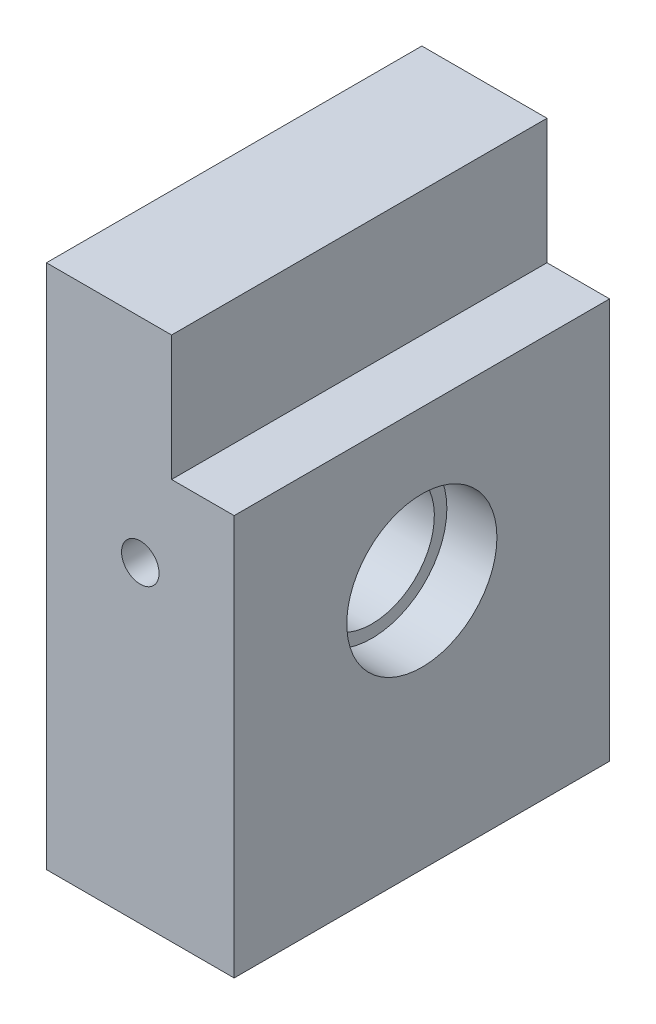
ISO-10303-21;
HEADER;
FILE_DESCRIPTION(('STEP AP214'),'2;1');
FILE_NAME('part.step','',(''),(''),'','','');
FILE_SCHEMA(('AUTOMOTIVE_DESIGN { 1 0 10303 214 1 1 1 1 }'));
ENDSEC;
DATA;
#1=APPLICATION_CONTEXT('core data for automotive mechanical design processes');
#2=APPLICATION_PROTOCOL_DEFINITION('international standard','automotive_design',2000,#1);
#3=PRODUCT_CONTEXT('',#1,'mechanical');
#4=PRODUCT('Part','Part','',(#3));
#5=PRODUCT_RELATED_PRODUCT_CATEGORY('part','',(#4));
#6=PRODUCT_DEFINITION_FORMATION('','',#4);
#7=PRODUCT_DEFINITION_CONTEXT('part definition',#1,'design');
#8=PRODUCT_DEFINITION('design','',#6,#7);
#9=PRODUCT_DEFINITION_SHAPE('','',#8);
#10=(LENGTH_UNIT() NAMED_UNIT(*) SI_UNIT(.MILLI.,.METRE.));
#11=(NAMED_UNIT(*) PLANE_ANGLE_UNIT() SI_UNIT($,.RADIAN.));
#12=(NAMED_UNIT(*) SI_UNIT($,.STERADIAN.) SOLID_ANGLE_UNIT());
#13=UNCERTAINTY_MEASURE_WITH_UNIT(LENGTH_MEASURE(1.E-05),#10,'distance_accuracy_value','');
#14=(GEOMETRIC_REPRESENTATION_CONTEXT(3) GLOBAL_UNCERTAINTY_ASSIGNED_CONTEXT((#13)) GLOBAL_UNIT_ASSIGNED_CONTEXT((#10,
#11,#12)) REPRESENTATION_CONTEXT('',''));
#15=CARTESIAN_POINT('',(0.,0.,0.));
#16=DIRECTION('',(0.,0.,1.));
#17=DIRECTION('',(1.,0.,0.));
#18=AXIS2_PLACEMENT_3D('',#15,#16,#17);
#19=CARTESIAN_POINT('',(9.99999999999952,0.,30.));
#20=DIRECTION('',(0.,-1.,0.));
#21=DIRECTION('',(1.,0.,0.));
#22=AXIS2_PLACEMENT_3D('',#19,#20,#21);
#23=PLANE('',#22);
#24=DIRECTION('',(-1.,0.,0.));
#25=VECTOR('',#24,1.);
#26=CARTESIAN_POINT('',(10.,0.,0.));
#27=LINE('',#26,#25);
#28=CARTESIAN_POINT('',(10.,0.,0.));
#29=VERTEX_POINT('',#28);
#30=CARTESIAN_POINT('',(0.,0.,0.));
#31=VERTEX_POINT('',#30);
#32=EDGE_CURVE('E153',#29,#31,#27,.T.);
#33=ORIENTED_EDGE('',*,*,#32,.T.);
#34=DIRECTION('',(0.,0.,-1.));
#35=VECTOR('',#34,1.);
#36=CARTESIAN_POINT('',(-4.85722573273506E-13,0.,30.));
#37=LINE('',#36,#35);
#38=CARTESIAN_POINT('',(-4.85722573273506E-13,0.,30.));
#39=VERTEX_POINT('',#38);
#40=EDGE_CURVE('E13',#39,#31,#37,.T.);
#41=ORIENTED_EDGE('',*,*,#40,.F.);
#42=DIRECTION('',(-1.,0.,0.));
#43=VECTOR('',#42,1.);
#44=CARTESIAN_POINT('',(9.99999999999952,0.,30.));
#45=LINE('',#44,#43);
#46=CARTESIAN_POINT('',(9.99999999999952,0.,30.));
#47=VERTEX_POINT('',#46);
#48=EDGE_CURVE('E170',#47,#39,#45,.T.);
#49=ORIENTED_EDGE('',*,*,#48,.F.);
#50=DIRECTION('',(0.,0.,-1.));
#51=VECTOR('',#50,1.);
#52=CARTESIAN_POINT('',(9.99999999999952,0.,30.));
#53=LINE('',#52,#51);
#54=EDGE_CURVE('E149',#47,#29,#53,.T.);
#55=ORIENTED_EDGE('',*,*,#54,.T.);
#56=EDGE_LOOP('',(#33,#41,#49,#55));
#57=FACE_BOUND('',#56,.T.);
#58=ADVANCED_FACE('F61',(#57),#23,.F.);
#59=CARTESIAN_POINT('',(-4.85722573273506E-13,0.,30.));
#60=DIRECTION('',(1.,0.,0.));
#61=DIRECTION('',(0.,1.,0.));
#62=AXIS2_PLACEMENT_3D('',#59,#60,#61);
#63=PLANE('',#62);
#64=CARTESIAN_POINT('',(0.,-22.,15.));
#65=DIRECTION('',(-1.,0.,0.));
#66=DIRECTION('',(0.,-1.,0.));
#67=AXIS2_PLACEMENT_3D('',#64,#65,#66);
#68=CIRCLE('',#67,5.);
#69=CARTESIAN_POINT('',(0.,-27.,15.));
#70=VERTEX_POINT('',#69);
#71=EDGE_CURVE('E188',#70,#70,#68,.T.);
#72=ORIENTED_EDGE('',*,*,#71,.F.);
#73=EDGE_LOOP('',(#72));
#74=FACE_BOUND('',#73,.T.);
#75=DIRECTION('',(0.,-1.,0.));
#76=VECTOR('',#75,1.);
#77=CARTESIAN_POINT('',(0.,0.,0.));
#78=LINE('',#77,#76);
#79=CARTESIAN_POINT('',(0.,-42.,0.));
#80=VERTEX_POINT('',#79);
#81=EDGE_CURVE('E157',#31,#80,#78,.T.);
#82=ORIENTED_EDGE('',*,*,#81,.T.);
#83=DIRECTION('',(0.,0.,-1.));
#84=VECTOR('',#83,1.);
#85=CARTESIAN_POINT('',(-4.85722573273506E-13,-42.,30.));
#86=LINE('',#85,#84);
#87=CARTESIAN_POINT('',(-4.85722573273506E-13,-42.,30.));
#88=VERTEX_POINT('',#87);
#89=EDGE_CURVE('E71',#88,#80,#86,.T.);
#90=ORIENTED_EDGE('',*,*,#89,.F.);
#91=DIRECTION('',(0.,-1.,0.));
#92=VECTOR('',#91,1.);
#93=CARTESIAN_POINT('',(-4.85722573273506E-13,0.,30.));
#94=LINE('',#93,#92);
#95=EDGE_CURVE('E117',#39,#88,#94,.T.);
#96=ORIENTED_EDGE('',*,*,#95,.F.);
#97=ORIENTED_EDGE('',*,*,#40,.T.);
#98=EDGE_LOOP('',(#82,#90,#96,#97));
#99=FACE_BOUND('',#98,.T.);
#100=ADVANCED_FACE('F234',(#74,#99),#63,.F.);
#101=CARTESIAN_POINT('',(-4.85722573273506E-13,-42.,30.));
#102=DIRECTION('',(0.,1.,0.));
#103=DIRECTION('',(0.,0.,1.));
#104=AXIS2_PLACEMENT_3D('',#101,#102,#103);
#105=PLANE('',#104);
#106=CARTESIAN_POINT('',(7.09771603936056,-42.,24.));
#107=DIRECTION('',(0.,-1.,0.));
#108=DIRECTION('',(0.,0.,-1.));
#109=AXIS2_PLACEMENT_3D('',#106,#107,#108);
#110=CIRCLE('',#109,2.5);
#111=CARTESIAN_POINT('',(7.09771603936056,-42.,21.5));
#112=VERTEX_POINT('',#111);
#113=EDGE_CURVE('E285',#112,#112,#110,.T.);
#114=ORIENTED_EDGE('',*,*,#113,.F.);
#115=EDGE_LOOP('',(#114));
#116=FACE_BOUND('',#115,.T.);
#117=CARTESIAN_POINT('',(7.09771603936105,-42.,6.));
#118=DIRECTION('',(0.,-1.,0.));
#119=DIRECTION('',(0.,0.,-1.));
#120=AXIS2_PLACEMENT_3D('',#117,#118,#119);
#121=CIRCLE('',#120,2.5);
#122=CARTESIAN_POINT('',(7.09771603936105,-42.,3.5));
#123=VERTEX_POINT('',#122);
#124=EDGE_CURVE('E281',#123,#123,#121,.T.);
#125=ORIENTED_EDGE('',*,*,#124,.F.);
#126=EDGE_LOOP('',(#125));
#127=FACE_BOUND('',#126,.T.);
#128=DIRECTION('',(1.,0.,0.));
#129=VECTOR('',#128,1.);
#130=CARTESIAN_POINT('',(0.,-42.,0.));
#131=LINE('',#130,#129);
#132=CARTESIAN_POINT('',(15.,-42.,0.));
#133=VERTEX_POINT('',#132);
#134=EDGE_CURVE('E161',#80,#133,#131,.T.);
#135=ORIENTED_EDGE('',*,*,#134,.T.);
#136=DIRECTION('',(0.,0.,-1.));
#137=VECTOR('',#136,1.);
#138=CARTESIAN_POINT('',(14.9999999999995,-42.,30.));
#139=LINE('',#138,#137);
#140=CARTESIAN_POINT('',(14.9999999999995,-42.,30.));
#141=VERTEX_POINT('',#140);
#142=EDGE_CURVE('E141',#141,#133,#139,.T.);
#143=ORIENTED_EDGE('',*,*,#142,.F.);
#144=DIRECTION('',(1.,0.,0.));
#145=VECTOR('',#144,1.);
#146=CARTESIAN_POINT('',(-4.85722573273506E-13,-42.,30.));
#147=LINE('',#146,#145);
#148=EDGE_CURVE('E130',#88,#141,#147,.T.);
#149=ORIENTED_EDGE('',*,*,#148,.F.);
#150=ORIENTED_EDGE('',*,*,#89,.T.);
#151=EDGE_LOOP('',(#135,#143,#149,#150));
#152=FACE_BOUND('',#151,.T.);
#153=ADVANCED_FACE('F239',(#116,#127,#152),#105,.F.);
#154=CARTESIAN_POINT('',(14.9999999999995,-42.,30.));
#155=DIRECTION('',(-1.,0.,0.));
#156=DIRECTION('',(0.,0.,1.));
#157=AXIS2_PLACEMENT_3D('',#154,#155,#156);
#158=PLANE('',#157);
#159=CARTESIAN_POINT('',(15.,-22.,15.));
#160=DIRECTION('',(1.,0.,0.));
#161=DIRECTION('',(0.,0.,-1.));
#162=AXIS2_PLACEMENT_3D('',#159,#160,#161);
#163=CIRCLE('',#162,6.00000000000001);
#164=CARTESIAN_POINT('',(15.,-22.,8.99999999999999));
#165=VERTEX_POINT('',#164);
#166=EDGE_CURVE('E255',#165,#165,#163,.T.);
#167=ORIENTED_EDGE('',*,*,#166,.F.);
#168=EDGE_LOOP('',(#167));
#169=FACE_BOUND('',#168,.T.);
#170=DIRECTION('',(0.,1.,0.));
#171=VECTOR('',#170,1.);
#172=CARTESIAN_POINT('',(15.,-42.,0.));
#173=LINE('',#172,#171);
#174=CARTESIAN_POINT('',(15.,-9.99999999999999,0.));
#175=VERTEX_POINT('',#174);
#176=EDGE_CURVE('E139',#133,#175,#173,.T.);
#177=ORIENTED_EDGE('',*,*,#176,.T.);
#178=DIRECTION('',(0.,0.,-1.));
#179=VECTOR('',#178,1.);
#180=CARTESIAN_POINT('',(14.9999999999995,-9.99999999999999,30.));
#181=LINE('',#180,#179);
#182=CARTESIAN_POINT('',(14.9999999999995,-9.99999999999999,30.));
#183=VERTEX_POINT('',#182);
#184=EDGE_CURVE('E136',#183,#175,#181,.T.);
#185=ORIENTED_EDGE('',*,*,#184,.F.);
#186=DIRECTION('',(0.,1.,0.));
#187=VECTOR('',#186,1.);
#188=CARTESIAN_POINT('',(14.9999999999995,-42.,30.));
#189=LINE('',#188,#187);
#190=EDGE_CURVE('E124',#141,#183,#189,.T.);
#191=ORIENTED_EDGE('',*,*,#190,.F.);
#192=ORIENTED_EDGE('',*,*,#142,.T.);
#193=EDGE_LOOP('',(#177,#185,#191,#192));
#194=FACE_BOUND('',#193,.T.);
#195=ADVANCED_FACE('F137',(#169,#194),#158,.F.);
#196=CARTESIAN_POINT('',(14.9999999999995,-9.99999999999999,30.));
#197=DIRECTION('',(0.,-1.,0.));
#198=DIRECTION('',(1.,0.,0.));
#199=AXIS2_PLACEMENT_3D('',#196,#197,#198);
#200=PLANE('',#199);
#201=DIRECTION('',(-1.,0.,0.));
#202=VECTOR('',#201,1.);
#203=CARTESIAN_POINT('',(15.,-9.99999999999999,0.));
#204=LINE('',#203,#202);
#205=CARTESIAN_POINT('',(10.,-10.,0.));
#206=VERTEX_POINT('',#205);
#207=EDGE_CURVE('E103',#175,#206,#204,.T.);
#208=ORIENTED_EDGE('',*,*,#207,.T.);
#209=DIRECTION('',(0.,0.,-1.));
#210=VECTOR('',#209,1.);
#211=CARTESIAN_POINT('',(9.99999999999952,-10.,30.));
#212=LINE('',#211,#210);
#213=CARTESIAN_POINT('',(9.99999999999952,-10.,30.));
#214=VERTEX_POINT('',#213);
#215=EDGE_CURVE('E142',#214,#206,#212,.T.);
#216=ORIENTED_EDGE('',*,*,#215,.F.);
#217=DIRECTION('',(-1.,0.,0.));
#218=VECTOR('',#217,1.);
#219=CARTESIAN_POINT('',(14.9999999999995,-9.99999999999999,30.));
#220=LINE('',#219,#218);
#221=EDGE_CURVE('E128',#183,#214,#220,.T.);
#222=ORIENTED_EDGE('',*,*,#221,.F.);
#223=ORIENTED_EDGE('',*,*,#184,.T.);
#224=EDGE_LOOP('',(#208,#216,#222,#223));
#225=FACE_BOUND('',#224,.T.);
#226=ADVANCED_FACE('F144',(#225),#200,.F.);
#227=CARTESIAN_POINT('',(9.99999999999952,-10.,30.));
#228=DIRECTION('',(-1.,0.,0.));
#229=DIRECTION('',(0.,0.,1.));
#230=AXIS2_PLACEMENT_3D('',#227,#228,#229);
#231=PLANE('',#230);
#232=DIRECTION('',(0.,1.,0.));
#233=VECTOR('',#232,1.);
#234=CARTESIAN_POINT('',(10.,-10.,0.));
#235=LINE('',#234,#233);
#236=EDGE_CURVE('E109',#206,#29,#235,.T.);
#237=ORIENTED_EDGE('',*,*,#236,.T.);
#238=ORIENTED_EDGE('',*,*,#54,.F.);
#239=DIRECTION('',(0.,1.,0.));
#240=VECTOR('',#239,1.);
#241=CARTESIAN_POINT('',(9.99999999999952,-10.,30.));
#242=LINE('',#241,#240);
#243=EDGE_CURVE('E80',#214,#47,#242,.T.);
#244=ORIENTED_EDGE('',*,*,#243,.F.);
#245=ORIENTED_EDGE('',*,*,#215,.T.);
#246=EDGE_LOOP('',(#237,#238,#244,#245));
#247=FACE_BOUND('',#246,.T.);
#248=ADVANCED_FACE('F326',(#247),#231,.F.);
#249=CARTESIAN_POINT('',(-4.85722573273506E-13,0.,30.));
#250=DIRECTION('',(0.,0.,1.));
#251=DIRECTION('',(1.,0.,0.));
#252=AXIS2_PLACEMENT_3D('',#249,#250,#251);
#253=PLANE('',#252);
#254=CARTESIAN_POINT('',(7.49999999999952,-17.,30.));
#255=DIRECTION('',(0.,0.,1.));
#256=DIRECTION('',(1.,0.,0.));
#257=AXIS2_PLACEMENT_3D('',#254,#255,#256);
#258=CIRCLE('',#257,1.5);
#259=CARTESIAN_POINT('',(8.99999999999952,-17.,30.));
#260=VERTEX_POINT('',#259);
#261=EDGE_CURVE('E269',#260,#260,#258,.T.);
#262=ORIENTED_EDGE('',*,*,#261,.F.);
#263=EDGE_LOOP('',(#262));
#264=FACE_BOUND('',#263,.T.);
#265=ORIENTED_EDGE('',*,*,#48,.T.);
#266=ORIENTED_EDGE('',*,*,#95,.T.);
#267=ORIENTED_EDGE('',*,*,#148,.T.);
#268=ORIENTED_EDGE('',*,*,#190,.T.);
#269=ORIENTED_EDGE('',*,*,#221,.T.);
#270=ORIENTED_EDGE('',*,*,#243,.T.);
#271=EDGE_LOOP('',(#265,#266,#267,#268,#269,#270));
#272=FACE_BOUND('',#271,.T.);
#273=ADVANCED_FACE('F126',(#264,#272),#253,.T.);
#274=CARTESIAN_POINT('',(0.,0.,0.));
#275=DIRECTION('',(0.,0.,1.));
#276=DIRECTION('',(1.,0.,0.));
#277=AXIS2_PLACEMENT_3D('',#274,#275,#276);
#278=PLANE('',#277);
#279=CARTESIAN_POINT('',(7.50000000000001,-17.,0.));
#280=DIRECTION('',(0.,0.,1.));
#281=DIRECTION('',(1.,0.,0.));
#282=AXIS2_PLACEMENT_3D('',#279,#280,#281);
#283=CIRCLE('',#282,1.5);
#284=CARTESIAN_POINT('',(9.00000000000001,-17.,0.));
#285=VERTEX_POINT('',#284);
#286=EDGE_CURVE('E189',#285,#285,#283,.T.);
#287=ORIENTED_EDGE('',*,*,#286,.T.);
#288=EDGE_LOOP('',(#287));
#289=FACE_BOUND('',#288,.T.);
#290=ORIENTED_EDGE('',*,*,#32,.F.);
#291=ORIENTED_EDGE('',*,*,#236,.F.);
#292=ORIENTED_EDGE('',*,*,#207,.F.);
#293=ORIENTED_EDGE('',*,*,#176,.F.);
#294=ORIENTED_EDGE('',*,*,#134,.F.);
#295=ORIENTED_EDGE('',*,*,#81,.F.);
#296=EDGE_LOOP('',(#290,#291,#292,#293,#294,#295));
#297=FACE_BOUND('',#296,.T.);
#298=ADVANCED_FACE('F245',(#289,#297),#278,.F.);
#299=CARTESIAN_POINT('',(11.,-22.,15.));
#300=DIRECTION('',(1.,0.,0.));
#301=DIRECTION('',(0.,0.,-1.));
#302=AXIS2_PLACEMENT_3D('',#299,#300,#301);
#303=CYLINDRICAL_SURFACE('',#302,6.00000000000001);
#304=CARTESIAN_POINT('',(11.,-22.,15.));
#305=DIRECTION('',(1.,0.,0.));
#306=DIRECTION('',(0.,0.,-1.));
#307=AXIS2_PLACEMENT_3D('',#304,#305,#306);
#308=CIRCLE('',#307,6.00000000000001);
#309=CARTESIAN_POINT('',(11.,-22.,8.99999999999999));
#310=VERTEX_POINT('',#309);
#311=EDGE_CURVE('E158',#310,#310,#308,.T.);
#312=ORIENTED_EDGE('',*,*,#311,.F.);
#313=EDGE_LOOP('',(#312));
#314=FACE_BOUND('',#313,.T.);
#315=ORIENTED_EDGE('',*,*,#166,.T.);
#316=EDGE_LOOP('',(#315));
#317=FACE_BOUND('',#316,.T.);
#318=ADVANCED_FACE('F331',(#314,#317),#303,.F.);
#319=CARTESIAN_POINT('',(11.,-22.,15.));
#320=DIRECTION('',(1.,0.,0.));
#321=DIRECTION('',(0.,0.,-1.));
#322=AXIS2_PLACEMENT_3D('',#319,#320,#321);
#323=PLANE('',#322);
#324=CARTESIAN_POINT('',(11.,-22.,15.));
#325=DIRECTION('',(-1.,0.,0.));
#326=DIRECTION('',(0.,-1.,0.));
#327=AXIS2_PLACEMENT_3D('',#324,#325,#326);
#328=CIRCLE('',#327,5.);
#329=CARTESIAN_POINT('',(11.,-27.,15.));
#330=VERTEX_POINT('',#329);
#331=EDGE_CURVE('E259',#330,#330,#328,.T.);
#332=ORIENTED_EDGE('',*,*,#331,.T.);
#333=EDGE_LOOP('',(#332));
#334=FACE_BOUND('',#333,.T.);
#335=ORIENTED_EDGE('',*,*,#311,.T.);
#336=EDGE_LOOP('',(#335));
#337=FACE_BOUND('',#336,.T.);
#338=ADVANCED_FACE('F337',(#334,#337),#323,.T.);
#339=CARTESIAN_POINT('',(11.,-22.,15.));
#340=DIRECTION('',(-1.,0.,0.));
#341=DIRECTION('',(0.,-1.,0.));
#342=AXIS2_PLACEMENT_3D('',#339,#340,#341);
#343=CYLINDRICAL_SURFACE('',#342,5.);
#344=CARTESIAN_POINT('',(8.99999999999999,-17.,15.));
#345=CARTESIAN_POINT('',(8.99999680695287,-16.9999994897816,14.8731208987145));
#346=CARTESIAN_POINT('',(9.00002243927703,-17.0048311758052,14.7462517245575));
#347=CARTESIAN_POINT('',(8.99983774331535,-17.0241323652151,14.4932011478343));
#348=CARTESIAN_POINT('',(8.9996273386568,-17.0386049874313,14.3670199811595));
#349=CARTESIAN_POINT('',(8.99813938827137,-17.0771302624117,14.1159729716357));
#350=CARTESIAN_POINT('',(8.99686049215628,-17.1011950178367,13.9911089958027));
#351=CARTESIAN_POINT('',(8.99185633781225,-17.1587505703489,13.7436448669534));
#352=CARTESIAN_POINT('',(8.98813192091544,-17.1922381234492,13.6210439502854));
#353=CARTESIAN_POINT('',(8.97802702475358,-17.2572422994956,13.414340087637));
#354=CARTESIAN_POINT('',(8.9727412395057,-17.2864734520119,13.3294599125743));
#355=CARTESIAN_POINT('',(8.95910201958977,-17.3493685908962,13.1616163555058));
#356=CARTESIAN_POINT('',(8.95074926634734,-17.3830315915218,13.0786525520652));
#357=CARTESIAN_POINT('',(8.92997036517553,-17.4544971607711,12.9152120682132));
#358=CARTESIAN_POINT('',(8.91755162675912,-17.4922921168313,12.8347311529492));
#359=CARTESIAN_POINT('',(8.88744166473901,-17.5716687082698,12.6767051720648));
#360=CARTESIAN_POINT('',(8.86975285817403,-17.6132486016845,12.5991587789048));
#361=CARTESIAN_POINT('',(8.82166381205752,-17.7120716468905,12.4258489109573));
#362=CARTESIAN_POINT('',(8.78906994467557,-17.7703772918708,12.3312700390514));
#363=CARTESIAN_POINT('',(8.70950549813372,-17.8900807156294,12.1503932991551));
#364=CARTESIAN_POINT('',(8.66255429795529,-17.9514742337533,12.0640844735545));
#365=CARTESIAN_POINT('',(8.5653006387692,-18.0577830794335,11.9235386935711));
#366=CARTESIAN_POINT('',(8.51893474823412,-18.102892435842,11.8667484066402));
#367=CARTESIAN_POINT('',(8.41546399613598,-18.1901626316031,11.7612032677255));
#368=CARTESIAN_POINT('',(8.35837419596545,-18.2323274938334,11.7124373238564));
#369=CARTESIAN_POINT('',(8.24533478485889,-18.3030850585277,11.6332369060855));
#370=CARTESIAN_POINT('',(8.19125853610791,-18.3327307855422,11.6010802812139));
#371=CARTESIAN_POINT('',(8.07660188607596,-18.3861899480917,11.5442946583355));
#372=CARTESIAN_POINT('',(8.01602362746817,-18.410005296534,11.5196631907167));
#373=CARTESIAN_POINT('',(7.88927005208056,-18.4501421615076,11.4787294338109));
#374=CARTESIAN_POINT('',(7.8230618367688,-18.4664154548783,11.4624806700049));
#375=CARTESIAN_POINT('',(7.68747006659442,-18.4898249251138,11.4392483851494));
#376=CARTESIAN_POINT('',(7.61808808976489,-18.4969655927673,11.4322603102775));
#377=CARTESIAN_POINT('',(7.48636396252389,-18.5012248675265,11.4280853050139));
#378=CARTESIAN_POINT('',(7.42408219499998,-18.4993545832976,11.4299096113768));
#379=CARTESIAN_POINT('',(7.30091554920826,-18.4880144532494,11.4410647197585));
#380=CARTESIAN_POINT('',(7.24003035264553,-18.4785463571229,11.4503937935129));
#381=CARTESIAN_POINT('',(7.12264368742978,-18.4529749486195,11.4759501951981));
#382=CARTESIAN_POINT('',(7.06607592465938,-18.4370194233388,11.4920241174883));
#383=CARTESIAN_POINT('',(6.95714306841908,-18.3995099465436,11.5305344788416));
#384=CARTESIAN_POINT('',(6.90477870819969,-18.377955021024,11.5529720249076));
#385=CARTESIAN_POINT('',(6.80091088680365,-18.3284784186056,11.6056908275062));
#386=CARTESIAN_POINT('',(6.74984428953364,-18.3001754384588,11.6364705431062));
#387=CARTESIAN_POINT('',(6.65408494980089,-18.2400131637562,11.7038587503746));
#388=CARTESIAN_POINT('',(6.60939586456709,-18.2081518471659,11.7404705612369));
#389=CARTESIAN_POINT('',(6.50416640550842,-18.1246911923396,11.8396058706395));
#390=CARTESIAN_POINT('',(6.44794395490473,-18.0716547645662,11.9055099061515));
#391=CARTESIAN_POINT('',(6.3490931410727,-17.9647525065291,12.0462514237448));
#392=CARTESIAN_POINT('',(6.30649688297436,-17.9108850264104,12.1211094412063));
#393=CARTESIAN_POINT('',(6.24139969809609,-17.8175304321829,12.2591609120666));
#394=CARTESIAN_POINT('',(6.2165289095522,-17.7776250383392,12.3209910830319));
#395=CARTESIAN_POINT('',(6.17246834255908,-17.6997593577396,12.4478500332991));
#396=CARTESIAN_POINT('',(6.15328170874053,-17.6618001572376,12.5128805600153));
#397=CARTESIAN_POINT('',(6.11960610830232,-17.5883434931658,12.6456306305786));
#398=CARTESIAN_POINT('',(6.10512547487031,-17.5528504830275,12.7133547086829));
#399=CARTESIAN_POINT('',(6.08002439192146,-17.4847519102586,12.850945894034));
#400=CARTESIAN_POINT('',(6.06940524940377,-17.4521473280935,12.9208137182142));
#401=CARTESIAN_POINT('',(6.04570042150571,-17.3711285344444,13.105529577748));
#402=CARTESIAN_POINT('',(6.03506707556086,-17.325215293356,13.221796423211));
#403=CARTESIAN_POINT('',(6.01906962001829,-17.2421376733064,13.4577864385022));
#404=CARTESIAN_POINT('',(6.01370857754283,-17.2049783964434,13.5775115785323));
#405=CARTESIAN_POINT('',(6.00616038727419,-17.1397229471062,13.8195654754229));
#406=CARTESIAN_POINT('',(6.00397495968877,-17.1116316931183,13.9418956070137));
#407=CARTESIAN_POINT('',(6.001213457356,-17.0647303875136,14.1883081397667));
#408=CARTESIAN_POINT('',(6.00063707893393,-17.0459185851443,14.3123902058441));
#409=CARTESIAN_POINT('',(6.00002522284629,-17.0171196945431,14.5665317074572));
#410=CARTESIAN_POINT('',(6.00001195050741,-17.0075094867417,14.696634037211));
#411=CARTESIAN_POINT('',(5.99999403588385,-16.998483738549,14.9572033026188));
#412=CARTESIAN_POINT('',(5.99998939442209,-16.9990691702083,15.0876702718518));
#413=CARTESIAN_POINT('',(6.0000256605344,-17.0104349969004,15.3482116115403));
#414=CARTESIAN_POINT('',(6.00006658659542,-17.0212195294862,15.4782858011686));
#415=CARTESIAN_POINT('',(6.00084973954553,-17.052923019816,15.7371786653582));
#416=CARTESIAN_POINT('',(6.00159186819134,-17.0738405576564,15.8659975132471));
#417=CARTESIAN_POINT('',(6.00482162299013,-17.1222533101094,16.1047179897686));
#418=CARTESIAN_POINT('',(6.00706612506278,-17.1485171280479,16.2148738015943));
#419=CARTESIAN_POINT('',(6.01424619724909,-17.208441861718,16.4330990219508));
#420=CARTESIAN_POINT('',(6.01918221179467,-17.2421039985377,16.5411680828577));
#421=CARTESIAN_POINT('',(6.03328399637473,-17.3165054786173,16.754305339526));
#422=CARTESIAN_POINT('',(6.04244014619439,-17.3572285946634,16.8593797863882));
#423=CARTESIAN_POINT('',(6.06691305487097,-17.4453678712892,17.0658932293095));
#424=CARTESIAN_POINT('',(6.08222543320826,-17.4927792572322,17.1673347546276));
#425=CARTESIAN_POINT('',(6.12292442666868,-17.5975564926964,17.3733653331926));
#426=CARTESIAN_POINT('',(6.14900854960664,-17.6554119461163,17.4775746261201));
#427=CARTESIAN_POINT('',(6.21469743084341,-17.7763540457197,17.6785252666599));
#428=CARTESIAN_POINT('',(6.25428913965026,-17.8394355986702,17.7752737119033));
#429=CARTESIAN_POINT('',(6.34072879306495,-17.9539838643767,17.9389696903704));
#430=CARTESIAN_POINT('',(6.38427200134289,-18.005085953545,18.0078927966066));
#431=CARTESIAN_POINT('',(6.48402776573655,-18.1058034750309,18.1371812074333));
#432=CARTESIAN_POINT('',(6.54021898370078,-18.1554212535945,18.1975606496084));
#433=CARTESIAN_POINT('',(6.65116576435822,-18.2381668623482,18.2941862539775));
#434=CARTESIAN_POINT('',(6.70306166448704,-18.27240353617,18.3327526181523));
#435=CARTESIAN_POINT('',(6.81456604208582,-18.3357706125666,18.40229827897));
#436=CARTESIAN_POINT('',(6.87417186310228,-18.3649027658012,18.4332801782542));
#437=CARTESIAN_POINT('',(7.00062220455018,-18.4160883929101,18.4866845352483));
#438=CARTESIAN_POINT('',(7.06752104868973,-18.4380830979942,18.5090362046613));
#439=CARTESIAN_POINT('',(7.20617325130608,-18.472669390782,18.5438050457301));
#440=CARTESIAN_POINT('',(7.27792296622768,-18.4852679523293,18.556229585818));
#441=CARTESIAN_POINT('',(7.41389743747775,-18.4988760240916,18.5696224751466));
#442=CARTESIAN_POINT('',(7.47786827653496,-18.5011936285624,18.5718844357558));
#443=CARTESIAN_POINT('',(7.60535122778707,-18.4976519022859,18.5684122052844));
#444=CARTESIAN_POINT('',(7.6688634961356,-18.4917955011225,18.5626808790183));
#445=CARTESIAN_POINT('',(7.7901867417433,-18.4728770183231,18.5439476102738));
#446=CARTESIAN_POINT('',(7.84812213152149,-18.460208148144,18.5313419354995));
#447=CARTESIAN_POINT('',(7.9604054624964,-18.4287852977327,18.4995602683782));
#448=CARTESIAN_POINT('',(8.01475320054803,-18.4100309732764,18.4803839043563));
#449=CARTESIAN_POINT('',(8.12187383340119,-18.3663137261278,18.4347304494381));
#450=CARTESIAN_POINT('',(8.17436949972235,-18.3410522340543,18.4078924612171));
#451=CARTESIAN_POINT('',(8.27350610664886,-18.2864287337407,18.3482871638363));
#452=CARTESIAN_POINT('',(8.32014381308871,-18.2570644791076,18.3155166034781));
#453=CARTESIAN_POINT('',(8.42786383909939,-18.1811923657801,18.2282210306975));
#454=CARTESIAN_POINT('',(8.48542772928115,-18.1331154020503,18.1707120219849));
#455=CARTESIAN_POINT('',(8.58814057966785,-18.0349054862801,18.0470129054134));
#456=CARTESIAN_POINT('',(8.63326370774972,-17.9847685010011,17.9808051497997));
#457=CARTESIAN_POINT('',(8.70244982265086,-17.8979715995441,17.8596194222193));
#458=CARTESIAN_POINT('',(8.72894682254172,-17.8611484856955,17.8061077633399));
#459=CARTESIAN_POINT('',(8.776695278567,-17.7886265472671,17.6960502686806));
#460=CARTESIAN_POINT('',(8.79794406409625,-17.7529283031155,17.6395029058959));
#461=CARTESIAN_POINT('',(8.85501941354745,-17.6482858546321,17.4659243883085));
#462=CARTESIAN_POINT('',(8.88409692933982,-17.5819006239052,17.3451039900029));
#463=CARTESIAN_POINT('',(8.92554828443227,-17.4697839152365,17.1190009114277));
#464=CARTESIAN_POINT('',(8.93998361588091,-17.4224840714261,17.0148223721473));
#465=CARTESIAN_POINT('',(8.96283145033517,-17.3349224871262,16.8028295839082));
#466=CARTESIAN_POINT('',(8.97123983636656,-17.2946655717865,16.6950129022957));
#467=CARTESIAN_POINT('',(8.9839987523042,-17.2216336475214,16.4766458919136));
#468=CARTESIAN_POINT('',(8.98834853239835,-17.1888600219499,16.3660950618913));
#469=CARTESIAN_POINT('',(8.99454780143949,-17.1310297475515,16.1429816458948));
#470=CARTESIAN_POINT('',(8.99639819920773,-17.1059702962699,16.0304198062538));
#471=CARTESIAN_POINT('',(8.99920171072986,-17.0566291796072,15.7659732070961));
#472=CARTESIAN_POINT('',(8.99964907750007,-17.0353997984295,15.6135053418099));
#473=CARTESIAN_POINT('',(9.00005001775381,-17.0070894704974,15.3073529783389));
#474=CARTESIAN_POINT('',(9.00000386724856,-17.0000006179493,15.1536692082343));
#475=CARTESIAN_POINT('',(8.99999999999999,-17.,15.));
#476=B_SPLINE_CURVE_WITH_KNOTS('',3,(#344,#345,#346,#347,#348,#349,#350,#351,#352,#353,#354,
#355,#356,#357,#358,#359,#360,#361,#362,#363,#364,#365,#366,#367,#368,#369,#370,#371,#372,#373,
#374,#375,#376,#377,#378,#379,#380,#381,#382,#383,#384,#385,#386,#387,#388,#389,#390,#391,#392,
#393,#394,#395,#396,#397,#398,#399,#400,#401,#402,#403,#404,#405,#406,#407,#408,#409,#410,#411,
#412,#413,#414,#415,#416,#417,#418,#419,#420,#421,#422,#423,#424,#425,#426,#427,#428,#429,#430,
#431,#432,#433,#434,#435,#436,#437,#438,#439,#440,#441,#442,#443,#444,#445,#446,#447,#448,#449,
#450,#451,#452,#453,#454,#455,#456,#457,#458,#459,#460,#461,#462,#463,#464,#465,#466,#467,#468,
#469,#470,#471,#472,#473,#474,#475),.UNSPECIFIED.,.T.,.F.,(4,2,2,2,2,2,2,2,2,2,2,2,2,2,2,2,2,2,
2,2,2,2,2,2,2,2,2,2,2,2,2,2,2,2,2,2,2,2,2,2,2,2,2,2,2,2,2,2,2,2,2,2,2,2,2,2,2,2,2,2,2,2,2,2,2,
4),(0.,0.380528704772667,0.761180569887915,1.1423142420669,1.52331686154049,1.79294331471906,
2.06250989792014,2.331587954422,2.60054279173541,2.94694761558224,3.29288692390522,
3.55024490217172,3.80724409578129,4.01505154760845,4.22279072758337,4.43184044452639,
4.64078732581991,4.82687153250815,5.01291289833748,5.19493447682424,5.37698773885195,
5.57424020083043,5.77160532794475,6.07460541856798,6.3783142476362,6.61103501210046,
6.84388428469282,7.07714365839136,7.3104819100831,7.68627984453419,8.06229626747001,
8.43851629996451,8.81466532391232,9.20563403563901,9.59664002246388,9.98780469997257,
10.378914580756,10.7184407563299,11.0580230126348,11.3968349574739,11.7354062431179,
12.100601246699,12.4654444348112,12.7531382423463,13.0403502788633,13.2589967974848,
13.4775681811185,13.6978960984347,13.9180603245792,14.1092199543391,14.3003110896047,
14.4813999607257,14.6624990769361,14.8541721278038,15.0459505400562,15.327898254381,
15.6104270726845,15.8206017714752,16.0308832003862,16.4520325886654,16.7975811543841,
17.1433655381128,17.489213791556,17.8349362543467,18.2960702362415,18.7569463315197),.UNSPECIFIED.);
#477=CARTESIAN_POINT('',(8.99999999999999,-17.,15.));
#478=VERTEX_POINT('',#477);
#479=EDGE_CURVE('E180',#478,#478,#476,.T.);
#480=ORIENTED_EDGE('',*,*,#479,.T.);
#481=EDGE_LOOP('',(#480));
#482=FACE_BOUND('',#481,.T.);
#483=ORIENTED_EDGE('',*,*,#331,.F.);
#484=EDGE_LOOP('',(#483));
#485=FACE_BOUND('',#484,.T.);
#486=ORIENTED_EDGE('',*,*,#71,.T.);
#487=EDGE_LOOP('',(#486));
#488=FACE_BOUND('',#487,.T.);
#489=ADVANCED_FACE('F191',(#482,#485,#488),#343,.F.);
#490=CARTESIAN_POINT('',(7.50000000000001,-17.,0.));
#491=DIRECTION('',(0.,0.,1.));
#492=DIRECTION('',(1.,0.,0.));
#493=AXIS2_PLACEMENT_3D('',#490,#491,#492);
#494=CYLINDRICAL_SURFACE('',#493,1.5);
#495=ORIENTED_EDGE('',*,*,#261,.T.);
#496=EDGE_LOOP('',(#495));
#497=FACE_BOUND('',#496,.T.);
#498=ORIENTED_EDGE('',*,*,#286,.F.);
#499=EDGE_LOOP('',(#498));
#500=FACE_BOUND('',#499,.T.);
#501=ORIENTED_EDGE('',*,*,#479,.F.);
#502=EDGE_LOOP('',(#501));
#503=FACE_BOUND('',#502,.T.);
#504=ADVANCED_FACE('F194',(#497,#500,#503),#494,.F.);
#505=CARTESIAN_POINT('',(7.09771603936105,-33.,6.));
#506=DIRECTION('',(0.,-1.,0.));
#507=DIRECTION('',(0.,0.,-1.));
#508=AXIS2_PLACEMENT_3D('',#505,#506,#507);
#509=CYLINDRICAL_SURFACE('',#508,2.5);
#510=CARTESIAN_POINT('',(7.09771603936105,-33.,6.));
#511=DIRECTION('',(0.,-1.,0.));
#512=DIRECTION('',(0.,0.,-1.));
#513=AXIS2_PLACEMENT_3D('',#510,#511,#512);
#514=CIRCLE('',#513,2.5);
#515=CARTESIAN_POINT('',(7.09771603936105,-33.,3.5));
#516=VERTEX_POINT('',#515);
#517=EDGE_CURVE('E277',#516,#516,#514,.T.);
#518=ORIENTED_EDGE('',*,*,#517,.F.);
#519=EDGE_LOOP('',(#518));
#520=FACE_BOUND('',#519,.T.);
#521=ORIENTED_EDGE('',*,*,#124,.T.);
#522=EDGE_LOOP('',(#521));
#523=FACE_BOUND('',#522,.T.);
#524=ADVANCED_FACE('F198',(#520,#523),#509,.F.);
#525=CARTESIAN_POINT('',(7.09771603936105,-33.,6.));
#526=DIRECTION('',(0.,-1.,0.));
#527=DIRECTION('',(0.,0.,-1.));
#528=AXIS2_PLACEMENT_3D('',#525,#526,#527);
#529=PLANE('',#528);
#530=CARTESIAN_POINT('',(7.09771603936105,-33.,6.));
#531=DIRECTION('',(0.,-1.,0.));
#532=DIRECTION('',(0.,0.,-1.));
#533=AXIS2_PLACEMENT_3D('',#530,#531,#532);
#534=CIRCLE('',#533,2.);
#535=CARTESIAN_POINT('',(7.09771603936105,-33.,4.));
#536=VERTEX_POINT('',#535);
#537=EDGE_CURVE('E64',#536,#536,#534,.T.);
#538=ORIENTED_EDGE('',*,*,#537,.F.);
#539=EDGE_LOOP('',(#538));
#540=FACE_BOUND('',#539,.T.);
#541=ORIENTED_EDGE('',*,*,#517,.T.);
#542=EDGE_LOOP('',(#541));
#543=FACE_BOUND('',#542,.T.);
#544=ADVANCED_FACE('F200',(#540,#543),#529,.T.);
#545=CARTESIAN_POINT('',(7.09771603936056,-33.,24.));
#546=DIRECTION('',(0.,-1.,0.));
#547=DIRECTION('',(0.,0.,-1.));
#548=AXIS2_PLACEMENT_3D('',#545,#546,#547);
#549=CYLINDRICAL_SURFACE('',#548,2.5);
#550=CARTESIAN_POINT('',(7.09771603936056,-33.,24.));
#551=DIRECTION('',(0.,-1.,0.));
#552=DIRECTION('',(0.,0.,-1.));
#553=AXIS2_PLACEMENT_3D('',#550,#551,#552);
#554=CIRCLE('',#553,2.5);
#555=CARTESIAN_POINT('',(7.09771603936056,-33.,21.5));
#556=VERTEX_POINT('',#555);
#557=EDGE_CURVE('E273',#556,#556,#554,.T.);
#558=ORIENTED_EDGE('',*,*,#557,.F.);
#559=EDGE_LOOP('',(#558));
#560=FACE_BOUND('',#559,.T.);
#561=ORIENTED_EDGE('',*,*,#113,.T.);
#562=EDGE_LOOP('',(#561));
#563=FACE_BOUND('',#562,.T.);
#564=ADVANCED_FACE('F203',(#560,#563),#549,.F.);
#565=CARTESIAN_POINT('',(7.09771603936056,-33.,24.));
#566=DIRECTION('',(0.,-1.,0.));
#567=DIRECTION('',(0.,0.,-1.));
#568=AXIS2_PLACEMENT_3D('',#565,#566,#567);
#569=PLANE('',#568);
#570=CARTESIAN_POINT('',(7.09771603936056,-33.,24.));
#571=DIRECTION('',(0.,-1.,0.));
#572=DIRECTION('',(0.,0.,-1.));
#573=AXIS2_PLACEMENT_3D('',#570,#571,#572);
#574=CIRCLE('',#573,2.);
#575=CARTESIAN_POINT('',(7.09771603936056,-33.,22.));
#576=VERTEX_POINT('',#575);
#577=EDGE_CURVE('E190',#576,#576,#574,.T.);
#578=ORIENTED_EDGE('',*,*,#577,.F.);
#579=EDGE_LOOP('',(#578));
#580=FACE_BOUND('',#579,.T.);
#581=ORIENTED_EDGE('',*,*,#557,.T.);
#582=EDGE_LOOP('',(#581));
#583=FACE_BOUND('',#582,.T.);
#584=ADVANCED_FACE('F210',(#580,#583),#569,.T.);
#585=CARTESIAN_POINT('',(7.09771603936056,-31.,24.));
#586=DIRECTION('',(0.,-1.,0.));
#587=DIRECTION('',(0.,0.,-1.));
#588=AXIS2_PLACEMENT_3D('',#585,#586,#587);
#589=CYLINDRICAL_SURFACE('',#588,2.);
#590=ORIENTED_EDGE('',*,*,#577,.T.);
#591=EDGE_LOOP('',(#590));
#592=FACE_BOUND('',#591,.T.);
#593=CARTESIAN_POINT('',(7.09771603936056,-31.,24.));
#594=DIRECTION('',(0.,-1.,0.));
#595=DIRECTION('',(0.,0.,-1.));
#596=AXIS2_PLACEMENT_3D('',#593,#594,#595);
#597=CIRCLE('',#596,2.);
#598=CARTESIAN_POINT('',(7.09771603936056,-31.,22.));
#599=VERTEX_POINT('',#598);
#600=EDGE_CURVE('E296',#599,#599,#597,.T.);
#601=ORIENTED_EDGE('',*,*,#600,.F.);
#602=EDGE_LOOP('',(#601));
#603=FACE_BOUND('',#602,.T.);
#604=ADVANCED_FACE('F214',(#592,#603),#589,.F.);
#605=CARTESIAN_POINT('',(7.09771603936056,-31.,24.));
#606=DIRECTION('',(0.,-1.,0.));
#607=DIRECTION('',(0.,0.,-1.));
#608=AXIS2_PLACEMENT_3D('',#605,#606,#607);
#609=PLANE('',#608);
#610=ORIENTED_EDGE('',*,*,#600,.T.);
#611=EDGE_LOOP('',(#610));
#612=FACE_BOUND('',#611,.T.);
#613=ADVANCED_FACE('F223',(#612),#609,.T.);
#614=CARTESIAN_POINT('',(7.09771603936105,-31.,6.));
#615=DIRECTION('',(0.,-1.,0.));
#616=DIRECTION('',(0.,0.,-1.));
#617=AXIS2_PLACEMENT_3D('',#614,#615,#616);
#618=CYLINDRICAL_SURFACE('',#617,2.);
#619=ORIENTED_EDGE('',*,*,#537,.T.);
#620=EDGE_LOOP('',(#619));
#621=FACE_BOUND('',#620,.T.);
#622=CARTESIAN_POINT('',(7.09771603936105,-31.,6.));
#623=DIRECTION('',(0.,-1.,0.));
#624=DIRECTION('',(0.,0.,-1.));
#625=AXIS2_PLACEMENT_3D('',#622,#623,#624);
#626=CIRCLE('',#625,2.);
#627=CARTESIAN_POINT('',(7.09771603936105,-31.,4.));
#628=VERTEX_POINT('',#627);
#629=EDGE_CURVE('E292',#628,#628,#626,.T.);
#630=ORIENTED_EDGE('',*,*,#629,.F.);
#631=EDGE_LOOP('',(#630));
#632=FACE_BOUND('',#631,.T.);
#633=ADVANCED_FACE('F219',(#621,#632),#618,.F.);
#634=CARTESIAN_POINT('',(7.09771603936105,-31.,6.));
#635=DIRECTION('',(0.,-1.,0.));
#636=DIRECTION('',(0.,0.,-1.));
#637=AXIS2_PLACEMENT_3D('',#634,#635,#636);
#638=PLANE('',#637);
#639=ORIENTED_EDGE('',*,*,#629,.T.);
#640=EDGE_LOOP('',(#639));
#641=FACE_BOUND('',#640,.T.);
#642=ADVANCED_FACE('F216',(#641),#638,.T.);
#643=CLOSED_SHELL('',(#58,#100,#153,#195,#226,#248,#273,#298,#318,#338,#489,#504,#524,#544,#564,
#584,#604,#613,#633,#642));
#644=MANIFOLD_SOLID_BREP('B2',#643);
#645=ADVANCED_BREP_SHAPE_REPRESENTATION('',(#18,#644),#14);
#646=SHAPE_DEFINITION_REPRESENTATION(#9,#645);
ENDSEC;
END-ISO-10303-21;
